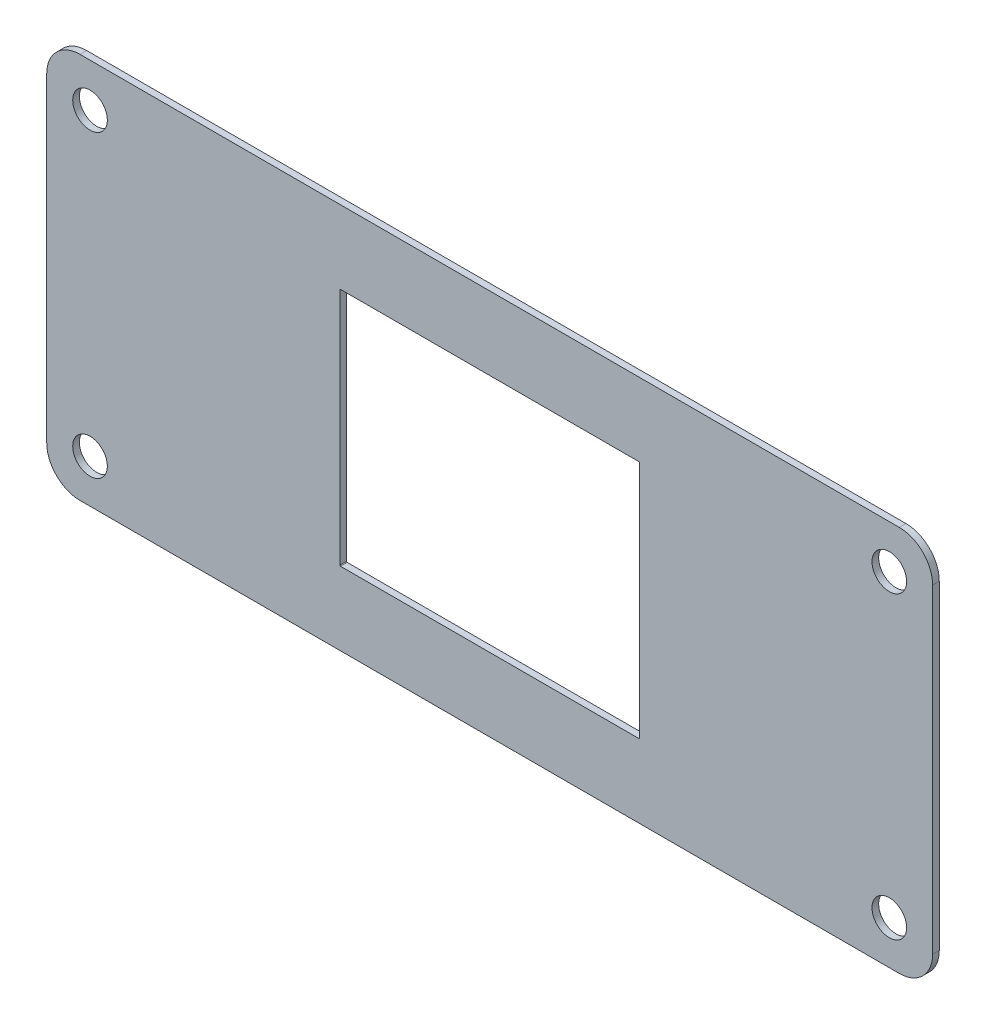
ISO-10303-21;
HEADER;
FILE_DESCRIPTION(('STEP AP214'),'2;1');
FILE_NAME('part.step','',(''),(''),'','','');
FILE_SCHEMA(('AUTOMOTIVE_DESIGN { 1 0 10303 214 1 1 1 1 }'));
ENDSEC;
DATA;
#1=APPLICATION_CONTEXT('core data for automotive mechanical design processes');
#2=APPLICATION_PROTOCOL_DEFINITION('international standard','automotive_design',2000,#1);
#3=PRODUCT_CONTEXT('',#1,'mechanical');
#4=PRODUCT('Part','Part','',(#3));
#5=PRODUCT_RELATED_PRODUCT_CATEGORY('part','',(#4));
#6=PRODUCT_DEFINITION_FORMATION('','',#4);
#7=PRODUCT_DEFINITION_CONTEXT('part definition',#1,'design');
#8=PRODUCT_DEFINITION('design','',#6,#7);
#9=PRODUCT_DEFINITION_SHAPE('','',#8);
#10=(LENGTH_UNIT() NAMED_UNIT(*) SI_UNIT(.MILLI.,.METRE.));
#11=(NAMED_UNIT(*) PLANE_ANGLE_UNIT() SI_UNIT($,.RADIAN.));
#12=(NAMED_UNIT(*) SI_UNIT($,.STERADIAN.) SOLID_ANGLE_UNIT());
#13=UNCERTAINTY_MEASURE_WITH_UNIT(LENGTH_MEASURE(1.E-05),#10,'distance_accuracy_value','');
#14=(GEOMETRIC_REPRESENTATION_CONTEXT(3) GLOBAL_UNCERTAINTY_ASSIGNED_CONTEXT((#13)) GLOBAL_UNIT_ASSIGNED_CONTEXT((#10,
#11,#12)) REPRESENTATION_CONTEXT('',''));
#15=CARTESIAN_POINT('',(0.,0.,0.));
#16=DIRECTION('',(0.,0.,1.));
#17=DIRECTION('',(1.,0.,0.));
#18=AXIS2_PLACEMENT_3D('',#15,#16,#17);
#19=CARTESIAN_POINT('',(0.,0.,1.));
#20=DIRECTION('',(0.,0.,-1.));
#21=DIRECTION('',(-1.,0.,0.));
#22=AXIS2_PLACEMENT_3D('',#19,#20,#21);
#23=PLANE('',#22);
#24=CARTESIAN_POINT('',(-60.,-22.5,1.));
#25=DIRECTION('',(0.,0.,-1.));
#26=DIRECTION('',(-1.,0.,0.));
#27=AXIS2_PLACEMENT_3D('',#24,#25,#26);
#28=CIRCLE('',#27,2.6);
#29=CARTESIAN_POINT('',(-62.6,-22.5,1.));
#30=VERTEX_POINT('',#29);
#31=EDGE_CURVE('E507',#30,#30,#28,.T.);
#32=ORIENTED_EDGE('',*,*,#31,.T.);
#33=EDGE_LOOP('',(#32));
#34=FACE_BOUND('',#33,.T.);
#35=CARTESIAN_POINT('',(60.,-22.5,1.));
#36=DIRECTION('',(0.,0.,-1.));
#37=DIRECTION('',(-1.,0.,0.));
#38=AXIS2_PLACEMENT_3D('',#35,#36,#37);
#39=CIRCLE('',#38,2.59999999999999);
#40=CARTESIAN_POINT('',(57.4,-22.5,1.));
#41=VERTEX_POINT('',#40);
#42=EDGE_CURVE('E499',#41,#41,#39,.T.);
#43=ORIENTED_EDGE('',*,*,#42,.T.);
#44=EDGE_LOOP('',(#43));
#45=FACE_BOUND('',#44,.T.);
#46=CARTESIAN_POINT('',(60.,22.5,1.));
#47=DIRECTION('',(0.,0.,-1.));
#48=DIRECTION('',(-1.,0.,0.));
#49=AXIS2_PLACEMENT_3D('',#46,#47,#48);
#50=CIRCLE('',#49,2.59999999999999);
#51=CARTESIAN_POINT('',(57.4,22.5,1.));
#52=VERTEX_POINT('',#51);
#53=EDGE_CURVE('E486',#52,#52,#50,.T.);
#54=ORIENTED_EDGE('',*,*,#53,.T.);
#55=EDGE_LOOP('',(#54));
#56=FACE_BOUND('',#55,.T.);
#57=CARTESIAN_POINT('',(-60.,22.5,1.));
#58=DIRECTION('',(0.,0.,-1.));
#59=DIRECTION('',(-1.,0.,0.));
#60=AXIS2_PLACEMENT_3D('',#57,#58,#59);
#61=CIRCLE('',#60,2.6);
#62=CARTESIAN_POINT('',(-62.6,22.5,1.));
#63=VERTEX_POINT('',#62);
#64=EDGE_CURVE('E469',#63,#63,#61,.T.);
#65=ORIENTED_EDGE('',*,*,#64,.T.);
#66=EDGE_LOOP('',(#65));
#67=FACE_BOUND('',#66,.T.);
#68=DIRECTION('',(0.,-1.,0.));
#69=VECTOR('',#68,1.);
#70=CARTESIAN_POINT('',(-66.5,-29.,1.));
#71=LINE('',#70,#69);
#72=CARTESIAN_POINT('',(-66.5,24.,1.));
#73=VERTEX_POINT('',#72);
#74=CARTESIAN_POINT('',(-66.5,-24.,1.));
#75=VERTEX_POINT('',#74);
#76=EDGE_CURVE('E224',#73,#75,#71,.T.);
#77=ORIENTED_EDGE('',*,*,#76,.T.);
#78=CARTESIAN_POINT('',(-61.5,-24.,1.));
#79=DIRECTION('',(0.,0.,-1.));
#80=DIRECTION('',(-1.,0.,0.));
#81=AXIS2_PLACEMENT_3D('',#78,#79,#80);
#82=CIRCLE('',#81,5.);
#83=CARTESIAN_POINT('',(-61.5,-29.,1.));
#84=VERTEX_POINT('',#83);
#85=EDGE_CURVE('E259',#75,#84,#82,.F.);
#86=ORIENTED_EDGE('',*,*,#85,.T.);
#87=DIRECTION('',(1.,0.,0.));
#88=VECTOR('',#87,1.);
#89=CARTESIAN_POINT('',(-66.5,-29.,1.));
#90=LINE('',#89,#88);
#91=CARTESIAN_POINT('',(61.5,-29.,1.));
#92=VERTEX_POINT('',#91);
#93=EDGE_CURVE('E218',#84,#92,#90,.T.);
#94=ORIENTED_EDGE('',*,*,#93,.T.);
#95=CARTESIAN_POINT('',(61.5,-24.,1.));
#96=DIRECTION('',(0.,0.,-1.));
#97=DIRECTION('',(-1.,0.,0.));
#98=AXIS2_PLACEMENT_3D('',#95,#96,#97);
#99=CIRCLE('',#98,5.);
#100=CARTESIAN_POINT('',(66.5,-24.,1.));
#101=VERTEX_POINT('',#100);
#102=EDGE_CURVE('E256',#92,#101,#99,.F.);
#103=ORIENTED_EDGE('',*,*,#102,.T.);
#104=DIRECTION('',(0.,1.,0.));
#105=VECTOR('',#104,1.);
#106=CARTESIAN_POINT('',(66.5,-29.,1.));
#107=LINE('',#106,#105);
#108=CARTESIAN_POINT('',(66.5,24.,1.));
#109=VERTEX_POINT('',#108);
#110=EDGE_CURVE('E207',#101,#109,#107,.T.);
#111=ORIENTED_EDGE('',*,*,#110,.T.);
#112=CARTESIAN_POINT('',(61.5,24.,1.));
#113=DIRECTION('',(0.,0.,-1.));
#114=DIRECTION('',(-1.,0.,0.));
#115=AXIS2_PLACEMENT_3D('',#112,#113,#114);
#116=CIRCLE('',#115,5.);
#117=CARTESIAN_POINT('',(61.5,29.,1.));
#118=VERTEX_POINT('',#117);
#119=EDGE_CURVE('E65',#109,#118,#116,.F.);
#120=ORIENTED_EDGE('',*,*,#119,.T.);
#121=DIRECTION('',(-1.,0.,0.));
#122=VECTOR('',#121,1.);
#123=CARTESIAN_POINT('',(-66.5,29.,1.));
#124=LINE('',#123,#122);
#125=CARTESIAN_POINT('',(-61.5,29.,1.));
#126=VERTEX_POINT('',#125);
#127=EDGE_CURVE('E210',#118,#126,#124,.T.);
#128=ORIENTED_EDGE('',*,*,#127,.T.);
#129=CARTESIAN_POINT('',(-61.5,24.,1.));
#130=DIRECTION('',(0.,0.,-1.));
#131=DIRECTION('',(-1.,0.,0.));
#132=AXIS2_PLACEMENT_3D('',#129,#130,#131);
#133=CIRCLE('',#132,5.);
#134=EDGE_CURVE('E252',#126,#73,#133,.F.);
#135=ORIENTED_EDGE('',*,*,#134,.T.);
#136=EDGE_LOOP('',(#77,#86,#94,#103,#111,#120,#128,#135));
#137=FACE_BOUND('',#136,.T.);
#138=CARTESIAN_POINT('',(22.4,-17.9,1.));
#139=DIRECTION('',(0.,0.,-1.));
#140=DIRECTION('',(-1.,0.,0.));
#141=AXIS2_PLACEMENT_3D('',#138,#139,#140);
#142=CIRCLE('',#141,0.0999999999999994);
#143=CARTESIAN_POINT('',(22.5,-17.9,1.));
#144=VERTEX_POINT('',#143);
#145=CARTESIAN_POINT('',(22.4,-18.,1.));
#146=VERTEX_POINT('',#145);
#147=EDGE_CURVE('E175',#144,#146,#142,.T.);
#148=ORIENTED_EDGE('',*,*,#147,.T.);
#149=DIRECTION('',(-1.,0.,0.));
#150=VECTOR('',#149,1.);
#151=CARTESIAN_POINT('',(-22.4,-18.,1.));
#152=LINE('',#151,#150);
#153=CARTESIAN_POINT('',(-22.4,-18.,1.));
#154=VERTEX_POINT('',#153);
#155=EDGE_CURVE('E158',#146,#154,#152,.T.);
#156=ORIENTED_EDGE('',*,*,#155,.T.);
#157=CARTESIAN_POINT('',(-22.4,-17.9,1.));
#158=DIRECTION('',(0.,0.,-1.));
#159=DIRECTION('',(-1.,0.,0.));
#160=AXIS2_PLACEMENT_3D('',#157,#158,#159);
#161=CIRCLE('',#160,0.0999999999999959);
#162=CARTESIAN_POINT('',(-22.5,-17.9,1.));
#163=VERTEX_POINT('',#162);
#164=EDGE_CURVE('E462',#154,#163,#161,.T.);
#165=ORIENTED_EDGE('',*,*,#164,.T.);
#166=DIRECTION('',(0.,1.,0.));
#167=VECTOR('',#166,1.);
#168=CARTESIAN_POINT('',(-22.5,-17.9,1.));
#169=LINE('',#168,#167);
#170=CARTESIAN_POINT('',(-22.5,17.9,1.));
#171=VERTEX_POINT('',#170);
#172=EDGE_CURVE('E461',#163,#171,#169,.T.);
#173=ORIENTED_EDGE('',*,*,#172,.T.);
#174=CARTESIAN_POINT('',(-22.4,17.9,1.));
#175=DIRECTION('',(0.,0.,-1.));
#176=DIRECTION('',(-1.,0.,0.));
#177=AXIS2_PLACEMENT_3D('',#174,#175,#176);
#178=CIRCLE('',#177,0.0999999999999959);
#179=CARTESIAN_POINT('',(-22.4,18.,1.));
#180=VERTEX_POINT('',#179);
#181=EDGE_CURVE('E466',#171,#180,#178,.T.);
#182=ORIENTED_EDGE('',*,*,#181,.T.);
#183=DIRECTION('',(1.,0.,0.));
#184=VECTOR('',#183,1.);
#185=CARTESIAN_POINT('',(-22.4,18.,1.));
#186=LINE('',#185,#184);
#187=CARTESIAN_POINT('',(22.4,18.,1.));
#188=VERTEX_POINT('',#187);
#189=EDGE_CURVE('E454',#180,#188,#186,.T.);
#190=ORIENTED_EDGE('',*,*,#189,.T.);
#191=CARTESIAN_POINT('',(22.4,17.9,1.));
#192=DIRECTION('',(0.,0.,-1.));
#193=DIRECTION('',(-1.,0.,0.));
#194=AXIS2_PLACEMENT_3D('',#191,#192,#193);
#195=CIRCLE('',#194,0.0999999999999994);
#196=CARTESIAN_POINT('',(22.5,17.9,1.));
#197=VERTEX_POINT('',#196);
#198=EDGE_CURVE('E190',#188,#197,#195,.T.);
#199=ORIENTED_EDGE('',*,*,#198,.T.);
#200=DIRECTION('',(0.,-1.,0.));
#201=VECTOR('',#200,1.);
#202=CARTESIAN_POINT('',(22.5,-17.9,1.));
#203=LINE('',#202,#201);
#204=EDGE_CURVE('E183',#197,#144,#203,.T.);
#205=ORIENTED_EDGE('',*,*,#204,.T.);
#206=EDGE_LOOP('',(#148,#156,#165,#173,#182,#190,#199,#205));
#207=FACE_BOUND('',#206,.T.);
#208=ADVANCED_FACE('F44',(#34,#45,#56,#67,#137,#207),#23,.F.);
#209=CARTESIAN_POINT('',(0.,0.,0.));
#210=DIRECTION('',(0.,0.,-1.));
#211=DIRECTION('',(-1.,0.,0.));
#212=AXIS2_PLACEMENT_3D('',#209,#210,#211);
#213=PLANE('',#212);
#214=CARTESIAN_POINT('',(-60.,-22.5,0.));
#215=DIRECTION('',(0.,0.,1.));
#216=DIRECTION('',(-1.,0.,0.));
#217=AXIS2_PLACEMENT_3D('',#214,#215,#216);
#218=CIRCLE('',#217,2.6);
#219=CARTESIAN_POINT('',(-62.6,-22.5,0.));
#220=VERTEX_POINT('',#219);
#221=EDGE_CURVE('E510',#220,#220,#218,.T.);
#222=ORIENTED_EDGE('',*,*,#221,.T.);
#223=EDGE_LOOP('',(#222));
#224=FACE_BOUND('',#223,.T.);
#225=CARTESIAN_POINT('',(60.,-22.5,0.));
#226=DIRECTION('',(0.,0.,1.));
#227=DIRECTION('',(1.,0.,0.));
#228=AXIS2_PLACEMENT_3D('',#225,#226,#227);
#229=CIRCLE('',#228,2.59999999999999);
#230=CARTESIAN_POINT('',(62.6,-22.5,0.));
#231=VERTEX_POINT('',#230);
#232=EDGE_CURVE('E504',#231,#231,#229,.T.);
#233=ORIENTED_EDGE('',*,*,#232,.T.);
#234=EDGE_LOOP('',(#233));
#235=FACE_BOUND('',#234,.T.);
#236=CARTESIAN_POINT('',(60.,22.5,0.));
#237=DIRECTION('',(0.,0.,1.));
#238=DIRECTION('',(-1.,0.,0.));
#239=AXIS2_PLACEMENT_3D('',#236,#237,#238);
#240=CIRCLE('',#239,2.59999999999999);
#241=CARTESIAN_POINT('',(57.4,22.5,0.));
#242=VERTEX_POINT('',#241);
#243=EDGE_CURVE('E497',#242,#242,#240,.T.);
#244=ORIENTED_EDGE('',*,*,#243,.T.);
#245=EDGE_LOOP('',(#244));
#246=FACE_BOUND('',#245,.T.);
#247=CARTESIAN_POINT('',(-60.,22.5,0.));
#248=DIRECTION('',(0.,0.,1.));
#249=DIRECTION('',(1.,0.,0.));
#250=AXIS2_PLACEMENT_3D('',#247,#248,#249);
#251=CIRCLE('',#250,2.6);
#252=CARTESIAN_POINT('',(-57.4,22.5,0.));
#253=VERTEX_POINT('',#252);
#254=EDGE_CURVE('E464',#253,#253,#251,.T.);
#255=ORIENTED_EDGE('',*,*,#254,.T.);
#256=EDGE_LOOP('',(#255));
#257=FACE_BOUND('',#256,.T.);
#258=DIRECTION('',(1.,0.,0.));
#259=VECTOR('',#258,1.);
#260=CARTESIAN_POINT('',(-66.5,-29.,0.));
#261=LINE('',#260,#259);
#262=CARTESIAN_POINT('',(-61.5,-29.,0.));
#263=VERTEX_POINT('',#262);
#264=CARTESIAN_POINT('',(61.5,-29.,0.));
#265=VERTEX_POINT('',#264);
#266=EDGE_CURVE('E211',#263,#265,#261,.T.);
#267=ORIENTED_EDGE('',*,*,#266,.F.);
#268=CARTESIAN_POINT('',(-61.5,-24.,0.));
#269=DIRECTION('',(0.,0.,-1.));
#270=DIRECTION('',(-1.,0.,0.));
#271=AXIS2_PLACEMENT_3D('',#268,#269,#270);
#272=CIRCLE('',#271,5.);
#273=CARTESIAN_POINT('',(-66.5,-24.,0.));
#274=VERTEX_POINT('',#273);
#275=EDGE_CURVE('E245',#263,#274,#272,.T.);
#276=ORIENTED_EDGE('',*,*,#275,.T.);
#277=DIRECTION('',(0.,-1.,0.));
#278=VECTOR('',#277,1.);
#279=CARTESIAN_POINT('',(-66.5,-29.,0.));
#280=LINE('',#279,#278);
#281=CARTESIAN_POINT('',(-66.5,24.,0.));
#282=VERTEX_POINT('',#281);
#283=EDGE_CURVE('E230',#282,#274,#280,.T.);
#284=ORIENTED_EDGE('',*,*,#283,.F.);
#285=CARTESIAN_POINT('',(-61.5,24.,0.));
#286=DIRECTION('',(0.,0.,-1.));
#287=DIRECTION('',(-1.,0.,0.));
#288=AXIS2_PLACEMENT_3D('',#285,#286,#287);
#289=CIRCLE('',#288,5.);
#290=CARTESIAN_POINT('',(-61.5,29.,0.));
#291=VERTEX_POINT('',#290);
#292=EDGE_CURVE('E239',#282,#291,#289,.T.);
#293=ORIENTED_EDGE('',*,*,#292,.T.);
#294=DIRECTION('',(-1.,0.,0.));
#295=VECTOR('',#294,1.);
#296=CARTESIAN_POINT('',(-66.5,29.,0.));
#297=LINE('',#296,#295);
#298=CARTESIAN_POINT('',(61.5,29.,0.));
#299=VERTEX_POINT('',#298);
#300=EDGE_CURVE('E228',#299,#291,#297,.T.);
#301=ORIENTED_EDGE('',*,*,#300,.F.);
#302=CARTESIAN_POINT('',(61.5,24.,0.));
#303=DIRECTION('',(0.,0.,-1.));
#304=DIRECTION('',(-1.,0.,0.));
#305=AXIS2_PLACEMENT_3D('',#302,#303,#304);
#306=CIRCLE('',#305,5.);
#307=CARTESIAN_POINT('',(66.5,24.,0.));
#308=VERTEX_POINT('',#307);
#309=EDGE_CURVE('E241',#299,#308,#306,.T.);
#310=ORIENTED_EDGE('',*,*,#309,.T.);
#311=DIRECTION('',(0.,1.,0.));
#312=VECTOR('',#311,1.);
#313=CARTESIAN_POINT('',(66.5,-29.,0.));
#314=LINE('',#313,#312);
#315=CARTESIAN_POINT('',(66.5,-24.,0.));
#316=VERTEX_POINT('',#315);
#317=EDGE_CURVE('E170',#316,#308,#314,.T.);
#318=ORIENTED_EDGE('',*,*,#317,.F.);
#319=CARTESIAN_POINT('',(61.5,-24.,0.));
#320=DIRECTION('',(0.,0.,-1.));
#321=DIRECTION('',(-1.,0.,0.));
#322=AXIS2_PLACEMENT_3D('',#319,#320,#321);
#323=CIRCLE('',#322,5.);
#324=EDGE_CURVE('E243',#316,#265,#323,.T.);
#325=ORIENTED_EDGE('',*,*,#324,.T.);
#326=EDGE_LOOP('',(#267,#276,#284,#293,#301,#310,#318,#325));
#327=FACE_BOUND('',#326,.T.);
#328=DIRECTION('',(1.,0.,0.));
#329=VECTOR('',#328,1.);
#330=CARTESIAN_POINT('',(-22.4,-18.,0.));
#331=LINE('',#330,#329);
#332=CARTESIAN_POINT('',(-22.4,-18.,0.));
#333=VERTEX_POINT('',#332);
#334=CARTESIAN_POINT('',(22.4,-18.,0.));
#335=VERTEX_POINT('',#334);
#336=EDGE_CURVE('E179',#333,#335,#331,.T.);
#337=ORIENTED_EDGE('',*,*,#336,.T.);
#338=CARTESIAN_POINT('',(22.4,-17.9,0.));
#339=DIRECTION('',(0.,0.,1.));
#340=DIRECTION('',(-1.,0.,0.));
#341=AXIS2_PLACEMENT_3D('',#338,#339,#340);
#342=CIRCLE('',#341,0.0999999999999994);
#343=CARTESIAN_POINT('',(22.5,-17.9,0.));
#344=VERTEX_POINT('',#343);
#345=EDGE_CURVE('E178',#335,#344,#342,.T.);
#346=ORIENTED_EDGE('',*,*,#345,.T.);
#347=DIRECTION('',(0.,1.,0.));
#348=VECTOR('',#347,1.);
#349=CARTESIAN_POINT('',(22.5,-17.9,0.));
#350=LINE('',#349,#348);
#351=CARTESIAN_POINT('',(22.5,17.9,0.));
#352=VERTEX_POINT('',#351);
#353=EDGE_CURVE('E187',#344,#352,#350,.T.);
#354=ORIENTED_EDGE('',*,*,#353,.T.);
#355=CARTESIAN_POINT('',(22.4,17.9,0.));
#356=DIRECTION('',(0.,0.,1.));
#357=DIRECTION('',(1.,0.,0.));
#358=AXIS2_PLACEMENT_3D('',#355,#356,#357);
#359=CIRCLE('',#358,0.0999999999999994);
#360=CARTESIAN_POINT('',(22.4,18.,0.));
#361=VERTEX_POINT('',#360);
#362=EDGE_CURVE('E426',#352,#361,#359,.T.);
#363=ORIENTED_EDGE('',*,*,#362,.T.);
#364=DIRECTION('',(-1.,0.,0.));
#365=VECTOR('',#364,1.);
#366=CARTESIAN_POINT('',(-22.4,18.,0.));
#367=LINE('',#366,#365);
#368=CARTESIAN_POINT('',(-22.4,18.,0.));
#369=VERTEX_POINT('',#368);
#370=EDGE_CURVE('E430',#361,#369,#367,.T.);
#371=ORIENTED_EDGE('',*,*,#370,.T.);
#372=CARTESIAN_POINT('',(-22.4,17.9,0.));
#373=DIRECTION('',(0.,0.,1.));
#374=DIRECTION('',(1.,0.,0.));
#375=AXIS2_PLACEMENT_3D('',#372,#373,#374);
#376=CIRCLE('',#375,0.0999999999999959);
#377=CARTESIAN_POINT('',(-22.5,17.9,0.));
#378=VERTEX_POINT('',#377);
#379=EDGE_CURVE('E434',#369,#378,#376,.T.);
#380=ORIENTED_EDGE('',*,*,#379,.T.);
#381=DIRECTION('',(0.,-1.,0.));
#382=VECTOR('',#381,1.);
#383=CARTESIAN_POINT('',(-22.5,-17.9,0.));
#384=LINE('',#383,#382);
#385=CARTESIAN_POINT('',(-22.5,-17.9,0.));
#386=VERTEX_POINT('',#385);
#387=EDGE_CURVE('E437',#378,#386,#384,.T.);
#388=ORIENTED_EDGE('',*,*,#387,.T.);
#389=CARTESIAN_POINT('',(-22.4,-17.9,0.));
#390=DIRECTION('',(0.,0.,1.));
#391=DIRECTION('',(-1.,0.,0.));
#392=AXIS2_PLACEMENT_3D('',#389,#390,#391);
#393=CIRCLE('',#392,0.0999999999999959);
#394=EDGE_CURVE('E440',#386,#333,#393,.T.);
#395=ORIENTED_EDGE('',*,*,#394,.T.);
#396=EDGE_LOOP('',(#337,#346,#354,#363,#371,#380,#388,#395));
#397=FACE_BOUND('',#396,.T.);
#398=ADVANCED_FACE('F276',(#224,#235,#246,#257,#327,#397),#213,.T.);
#399=CARTESIAN_POINT('',(66.5,-29.,1.));
#400=DIRECTION('',(-1.,0.,0.));
#401=DIRECTION('',(0.,0.,1.));
#402=AXIS2_PLACEMENT_3D('',#399,#400,#401);
#403=PLANE('',#402);
#404=ORIENTED_EDGE('',*,*,#110,.F.);
#405=DIRECTION('',(0.,0.,-1.));
#406=VECTOR('',#405,1.);
#407=CARTESIAN_POINT('',(66.5,-24.,1.));
#408=LINE('',#407,#406);
#409=EDGE_CURVE('E264',#101,#316,#408,.T.);
#410=ORIENTED_EDGE('',*,*,#409,.T.);
#411=ORIENTED_EDGE('',*,*,#317,.T.);
#412=DIRECTION('',(0.,0.,-1.));
#413=VECTOR('',#412,1.);
#414=CARTESIAN_POINT('',(66.5,24.,1.));
#415=LINE('',#414,#413);
#416=EDGE_CURVE('E262',#308,#109,#415,.F.);
#417=ORIENTED_EDGE('',*,*,#416,.T.);
#418=EDGE_LOOP('',(#404,#410,#411,#417));
#419=FACE_BOUND('',#418,.T.);
#420=ADVANCED_FACE('F270',(#419),#403,.F.);
#421=CARTESIAN_POINT('',(-66.5,29.,1.));
#422=DIRECTION('',(0.,-1.,0.));
#423=DIRECTION('',(0.,0.,-1.));
#424=AXIS2_PLACEMENT_3D('',#421,#422,#423);
#425=PLANE('',#424);
#426=ORIENTED_EDGE('',*,*,#127,.F.);
#427=DIRECTION('',(0.,0.,-1.));
#428=VECTOR('',#427,1.);
#429=CARTESIAN_POINT('',(61.5,29.,1.));
#430=LINE('',#429,#428);
#431=EDGE_CURVE('E12',#118,#299,#430,.T.);
#432=ORIENTED_EDGE('',*,*,#431,.T.);
#433=ORIENTED_EDGE('',*,*,#300,.T.);
#434=DIRECTION('',(0.,0.,-1.));
#435=VECTOR('',#434,1.);
#436=CARTESIAN_POINT('',(-61.5,29.,1.));
#437=LINE('',#436,#435);
#438=EDGE_CURVE('E52',#291,#126,#437,.F.);
#439=ORIENTED_EDGE('',*,*,#438,.T.);
#440=EDGE_LOOP('',(#426,#432,#433,#439));
#441=FACE_BOUND('',#440,.T.);
#442=ADVANCED_FACE('F282',(#441),#425,.F.);
#443=CARTESIAN_POINT('',(-66.5,-29.,1.));
#444=DIRECTION('',(1.,0.,0.));
#445=DIRECTION('',(0.,0.,-1.));
#446=AXIS2_PLACEMENT_3D('',#443,#444,#445);
#447=PLANE('',#446);
#448=ORIENTED_EDGE('',*,*,#283,.T.);
#449=DIRECTION('',(0.,0.,-1.));
#450=VECTOR('',#449,1.);
#451=CARTESIAN_POINT('',(-66.5,-24.,1.));
#452=LINE('',#451,#450);
#453=EDGE_CURVE('E250',#274,#75,#452,.F.);
#454=ORIENTED_EDGE('',*,*,#453,.T.);
#455=ORIENTED_EDGE('',*,*,#76,.F.);
#456=DIRECTION('',(0.,0.,-1.));
#457=VECTOR('',#456,1.);
#458=CARTESIAN_POINT('',(-66.5,24.,1.));
#459=LINE('',#458,#457);
#460=EDGE_CURVE('E247',#73,#282,#459,.T.);
#461=ORIENTED_EDGE('',*,*,#460,.T.);
#462=EDGE_LOOP('',(#448,#454,#455,#461));
#463=FACE_BOUND('',#462,.T.);
#464=ADVANCED_FACE('F301',(#463),#447,.F.);
#465=CARTESIAN_POINT('',(-66.5,-29.,1.));
#466=DIRECTION('',(0.,1.,0.));
#467=DIRECTION('',(0.,0.,1.));
#468=AXIS2_PLACEMENT_3D('',#465,#466,#467);
#469=PLANE('',#468);
#470=ORIENTED_EDGE('',*,*,#93,.F.);
#471=DIRECTION('',(0.,0.,-1.));
#472=VECTOR('',#471,1.);
#473=CARTESIAN_POINT('',(-61.5,-29.,1.));
#474=LINE('',#473,#472);
#475=EDGE_CURVE('E236',#84,#263,#474,.T.);
#476=ORIENTED_EDGE('',*,*,#475,.T.);
#477=ORIENTED_EDGE('',*,*,#266,.T.);
#478=DIRECTION('',(0.,0.,-1.));
#479=VECTOR('',#478,1.);
#480=CARTESIAN_POINT('',(61.5,-29.,1.));
#481=LINE('',#480,#479);
#482=EDGE_CURVE('E223',#265,#92,#481,.F.);
#483=ORIENTED_EDGE('',*,*,#482,.T.);
#484=EDGE_LOOP('',(#470,#476,#477,#483));
#485=FACE_BOUND('',#484,.T.);
#486=ADVANCED_FACE('F298',(#485),#469,.F.);
#487=CARTESIAN_POINT('',(22.4,-17.9,1.001));
#488=DIRECTION('',(0.,0.,-1.));
#489=DIRECTION('',(-1.,0.,0.));
#490=AXIS2_PLACEMENT_3D('',#487,#488,#489);
#491=CYLINDRICAL_SURFACE('',#490,0.0999999999999994);
#492=DIRECTION('',(0.,0.,-1.));
#493=VECTOR('',#492,1.);
#494=CARTESIAN_POINT('',(22.5,-17.9,1.001));
#495=LINE('',#494,#493);
#496=EDGE_CURVE('E171',#144,#344,#495,.T.);
#497=ORIENTED_EDGE('',*,*,#496,.T.);
#498=ORIENTED_EDGE('',*,*,#345,.F.);
#499=DIRECTION('',(0.,0.,-1.));
#500=VECTOR('',#499,1.);
#501=CARTESIAN_POINT('',(22.4,-18.,1.001));
#502=LINE('',#501,#500);
#503=EDGE_CURVE('E162',#146,#335,#502,.T.);
#504=ORIENTED_EDGE('',*,*,#503,.F.);
#505=ORIENTED_EDGE('',*,*,#147,.F.);
#506=EDGE_LOOP('',(#497,#498,#504,#505));
#507=FACE_BOUND('',#506,.T.);
#508=ADVANCED_FACE('F174',(#507),#491,.F.);
#509=CARTESIAN_POINT('',(22.5,-17.9,1.001));
#510=DIRECTION('',(-1.,0.,0.));
#511=DIRECTION('',(0.,0.,1.));
#512=AXIS2_PLACEMENT_3D('',#509,#510,#511);
#513=PLANE('',#512);
#514=DIRECTION('',(0.,0.,-1.));
#515=VECTOR('',#514,1.);
#516=CARTESIAN_POINT('',(22.5,17.9,1.001));
#517=LINE('',#516,#515);
#518=EDGE_CURVE('E421',#197,#352,#517,.T.);
#519=ORIENTED_EDGE('',*,*,#518,.T.);
#520=ORIENTED_EDGE('',*,*,#353,.F.);
#521=ORIENTED_EDGE('',*,*,#496,.F.);
#522=ORIENTED_EDGE('',*,*,#204,.F.);
#523=EDGE_LOOP('',(#519,#520,#521,#522));
#524=FACE_BOUND('',#523,.T.);
#525=ADVANCED_FACE('F412',(#524),#513,.T.);
#526=CARTESIAN_POINT('',(22.4,17.9,1.001));
#527=DIRECTION('',(0.,0.,-1.));
#528=DIRECTION('',(-1.,0.,0.));
#529=AXIS2_PLACEMENT_3D('',#526,#527,#528);
#530=CYLINDRICAL_SURFACE('',#529,0.0999999999999994);
#531=DIRECTION('',(0.,0.,-1.));
#532=VECTOR('',#531,1.);
#533=CARTESIAN_POINT('',(22.4,18.,1.001));
#534=LINE('',#533,#532);
#535=EDGE_CURVE('E424',#188,#361,#534,.T.);
#536=ORIENTED_EDGE('',*,*,#535,.T.);
#537=ORIENTED_EDGE('',*,*,#362,.F.);
#538=ORIENTED_EDGE('',*,*,#518,.F.);
#539=ORIENTED_EDGE('',*,*,#198,.F.);
#540=EDGE_LOOP('',(#536,#537,#538,#539));
#541=FACE_BOUND('',#540,.T.);
#542=ADVANCED_FACE('F409',(#541),#530,.F.);
#543=CARTESIAN_POINT('',(-22.4,18.,1.001));
#544=DIRECTION('',(0.,-1.,0.));
#545=DIRECTION('',(0.,0.,-1.));
#546=AXIS2_PLACEMENT_3D('',#543,#544,#545);
#547=PLANE('',#546);
#548=DIRECTION('',(0.,0.,-1.));
#549=VECTOR('',#548,1.);
#550=CARTESIAN_POINT('',(-22.4,18.,1.001));
#551=LINE('',#550,#549);
#552=EDGE_CURVE('E449',#180,#369,#551,.T.);
#553=ORIENTED_EDGE('',*,*,#552,.T.);
#554=ORIENTED_EDGE('',*,*,#370,.F.);
#555=ORIENTED_EDGE('',*,*,#535,.F.);
#556=ORIENTED_EDGE('',*,*,#189,.F.);
#557=EDGE_LOOP('',(#553,#554,#555,#556));
#558=FACE_BOUND('',#557,.T.);
#559=ADVANCED_FACE('F405',(#558),#547,.T.);
#560=CARTESIAN_POINT('',(-22.4,17.9,1.001));
#561=DIRECTION('',(0.,0.,-1.));
#562=DIRECTION('',(-1.,0.,0.));
#563=AXIS2_PLACEMENT_3D('',#560,#561,#562);
#564=CYLINDRICAL_SURFACE('',#563,0.0999999999999959);
#565=DIRECTION('',(0.,0.,-1.));
#566=VECTOR('',#565,1.);
#567=CARTESIAN_POINT('',(-22.5,17.9,1.001));
#568=LINE('',#567,#566);
#569=EDGE_CURVE('E447',#171,#378,#568,.T.);
#570=ORIENTED_EDGE('',*,*,#569,.T.);
#571=ORIENTED_EDGE('',*,*,#379,.F.);
#572=ORIENTED_EDGE('',*,*,#552,.F.);
#573=ORIENTED_EDGE('',*,*,#181,.F.);
#574=EDGE_LOOP('',(#570,#571,#572,#573));
#575=FACE_BOUND('',#574,.T.);
#576=ADVANCED_FACE('F401',(#575),#564,.F.);
#577=CARTESIAN_POINT('',(-22.5,-17.9,1.001));
#578=DIRECTION('',(1.,0.,0.));
#579=DIRECTION('',(0.,0.,-1.));
#580=AXIS2_PLACEMENT_3D('',#577,#578,#579);
#581=PLANE('',#580);
#582=DIRECTION('',(0.,0.,-1.));
#583=VECTOR('',#582,1.);
#584=CARTESIAN_POINT('',(-22.5,-17.9,1.001));
#585=LINE('',#584,#583);
#586=EDGE_CURVE('E445',#163,#386,#585,.T.);
#587=ORIENTED_EDGE('',*,*,#586,.T.);
#588=ORIENTED_EDGE('',*,*,#387,.F.);
#589=ORIENTED_EDGE('',*,*,#569,.F.);
#590=ORIENTED_EDGE('',*,*,#172,.F.);
#591=EDGE_LOOP('',(#587,#588,#589,#590));
#592=FACE_BOUND('',#591,.T.);
#593=ADVANCED_FACE('F397',(#592),#581,.T.);
#594=CARTESIAN_POINT('',(-22.4,-17.9,1.001));
#595=DIRECTION('',(0.,0.,-1.));
#596=DIRECTION('',(-1.,0.,0.));
#597=AXIS2_PLACEMENT_3D('',#594,#595,#596);
#598=CYLINDRICAL_SURFACE('',#597,0.0999999999999959);
#599=DIRECTION('',(0.,0.,-1.));
#600=VECTOR('',#599,1.);
#601=CARTESIAN_POINT('',(-22.4,-18.,1.001));
#602=LINE('',#601,#600);
#603=EDGE_CURVE('E164',#154,#333,#602,.T.);
#604=ORIENTED_EDGE('',*,*,#603,.T.);
#605=ORIENTED_EDGE('',*,*,#394,.F.);
#606=ORIENTED_EDGE('',*,*,#586,.F.);
#607=ORIENTED_EDGE('',*,*,#164,.F.);
#608=EDGE_LOOP('',(#604,#605,#606,#607));
#609=FACE_BOUND('',#608,.T.);
#610=ADVANCED_FACE('F394',(#609),#598,.F.);
#611=CARTESIAN_POINT('',(-22.4,-18.,1.001));
#612=DIRECTION('',(0.,1.,0.));
#613=DIRECTION('',(0.,0.,1.));
#614=AXIS2_PLACEMENT_3D('',#611,#612,#613);
#615=PLANE('',#614);
#616=ORIENTED_EDGE('',*,*,#503,.T.);
#617=ORIENTED_EDGE('',*,*,#336,.F.);
#618=ORIENTED_EDGE('',*,*,#603,.F.);
#619=ORIENTED_EDGE('',*,*,#155,.F.);
#620=EDGE_LOOP('',(#616,#617,#618,#619));
#621=FACE_BOUND('',#620,.T.);
#622=ADVANCED_FACE('F160',(#621),#615,.T.);
#623=CARTESIAN_POINT('',(-61.5,-24.,1.));
#624=DIRECTION('',(0.,0.,-1.));
#625=DIRECTION('',(-1.,0.,0.));
#626=AXIS2_PLACEMENT_3D('',#623,#624,#625);
#627=CYLINDRICAL_SURFACE('',#626,5.);
#628=ORIENTED_EDGE('',*,*,#85,.F.);
#629=ORIENTED_EDGE('',*,*,#453,.F.);
#630=ORIENTED_EDGE('',*,*,#275,.F.);
#631=ORIENTED_EDGE('',*,*,#475,.F.);
#632=EDGE_LOOP('',(#628,#629,#630,#631));
#633=FACE_BOUND('',#632,.T.);
#634=ADVANCED_FACE('F296',(#633),#627,.T.);
#635=CARTESIAN_POINT('',(61.5,-24.,1.));
#636=DIRECTION('',(0.,0.,-1.));
#637=DIRECTION('',(-1.,0.,0.));
#638=AXIS2_PLACEMENT_3D('',#635,#636,#637);
#639=CYLINDRICAL_SURFACE('',#638,5.);
#640=ORIENTED_EDGE('',*,*,#102,.F.);
#641=ORIENTED_EDGE('',*,*,#482,.F.);
#642=ORIENTED_EDGE('',*,*,#324,.F.);
#643=ORIENTED_EDGE('',*,*,#409,.F.);
#644=EDGE_LOOP('',(#640,#641,#642,#643));
#645=FACE_BOUND('',#644,.T.);
#646=ADVANCED_FACE('F313',(#645),#639,.T.);
#647=CARTESIAN_POINT('',(61.5,24.,1.));
#648=DIRECTION('',(0.,0.,-1.));
#649=DIRECTION('',(-1.,0.,0.));
#650=AXIS2_PLACEMENT_3D('',#647,#648,#649);
#651=CYLINDRICAL_SURFACE('',#650,5.);
#652=ORIENTED_EDGE('',*,*,#119,.F.);
#653=ORIENTED_EDGE('',*,*,#416,.F.);
#654=ORIENTED_EDGE('',*,*,#309,.F.);
#655=ORIENTED_EDGE('',*,*,#431,.F.);
#656=EDGE_LOOP('',(#652,#653,#654,#655));
#657=FACE_BOUND('',#656,.T.);
#658=ADVANCED_FACE('F281',(#657),#651,.T.);
#659=CARTESIAN_POINT('',(-61.5,24.,1.));
#660=DIRECTION('',(0.,0.,-1.));
#661=DIRECTION('',(-1.,0.,0.));
#662=AXIS2_PLACEMENT_3D('',#659,#660,#661);
#663=CYLINDRICAL_SURFACE('',#662,5.);
#664=ORIENTED_EDGE('',*,*,#134,.F.);
#665=ORIENTED_EDGE('',*,*,#438,.F.);
#666=ORIENTED_EDGE('',*,*,#292,.F.);
#667=ORIENTED_EDGE('',*,*,#460,.F.);
#668=EDGE_LOOP('',(#664,#665,#666,#667));
#669=FACE_BOUND('',#668,.T.);
#670=ADVANCED_FACE('F46',(#669),#663,.T.);
#671=CARTESIAN_POINT('',(-60.,22.5,1.001));
#672=DIRECTION('',(0.,0.,-1.));
#673=DIRECTION('',(-1.,0.,0.));
#674=AXIS2_PLACEMENT_3D('',#671,#672,#673);
#675=CYLINDRICAL_SURFACE('',#674,2.6);
#676=ORIENTED_EDGE('',*,*,#254,.F.);
#677=EDGE_LOOP('',(#676));
#678=FACE_BOUND('',#677,.T.);
#679=ORIENTED_EDGE('',*,*,#64,.F.);
#680=EDGE_LOOP('',(#679));
#681=FACE_BOUND('',#680,.T.);
#682=ADVANCED_FACE('F304',(#678,#681),#675,.F.);
#683=CARTESIAN_POINT('',(60.,22.5,1.001));
#684=DIRECTION('',(0.,0.,-1.));
#685=DIRECTION('',(-1.,0.,0.));
#686=AXIS2_PLACEMENT_3D('',#683,#684,#685);
#687=CYLINDRICAL_SURFACE('',#686,2.59999999999999);
#688=ORIENTED_EDGE('',*,*,#243,.F.);
#689=EDGE_LOOP('',(#688));
#690=FACE_BOUND('',#689,.T.);
#691=ORIENTED_EDGE('',*,*,#53,.F.);
#692=EDGE_LOOP('',(#691));
#693=FACE_BOUND('',#692,.T.);
#694=ADVANCED_FACE('F310',(#690,#693),#687,.F.);
#695=CARTESIAN_POINT('',(60.,-22.5,1.001));
#696=DIRECTION('',(0.,0.,-1.));
#697=DIRECTION('',(-1.,0.,0.));
#698=AXIS2_PLACEMENT_3D('',#695,#696,#697);
#699=CYLINDRICAL_SURFACE('',#698,2.59999999999999);
#700=ORIENTED_EDGE('',*,*,#232,.F.);
#701=EDGE_LOOP('',(#700));
#702=FACE_BOUND('',#701,.T.);
#703=ORIENTED_EDGE('',*,*,#42,.F.);
#704=EDGE_LOOP('',(#703));
#705=FACE_BOUND('',#704,.T.);
#706=ADVANCED_FACE('F366',(#702,#705),#699,.F.);
#707=CARTESIAN_POINT('',(-60.,-22.5,1.001));
#708=DIRECTION('',(0.,0.,-1.));
#709=DIRECTION('',(-1.,0.,0.));
#710=AXIS2_PLACEMENT_3D('',#707,#708,#709);
#711=CYLINDRICAL_SURFACE('',#710,2.6);
#712=ORIENTED_EDGE('',*,*,#221,.F.);
#713=EDGE_LOOP('',(#712));
#714=FACE_BOUND('',#713,.T.);
#715=ORIENTED_EDGE('',*,*,#31,.F.);
#716=EDGE_LOOP('',(#715));
#717=FACE_BOUND('',#716,.T.);
#718=ADVANCED_FACE('F376',(#714,#717),#711,.F.);
#719=CLOSED_SHELL('',(#208,#398,#420,#442,#464,#486,#508,#525,#542,#559,#576,#593,#610,#622,
#634,#646,#658,#670,#682,#694,#706,#718));
#720=MANIFOLD_SOLID_BREP('B2',#719);
#721=ADVANCED_BREP_SHAPE_REPRESENTATION('',(#18,#720),#14);
#722=SHAPE_DEFINITION_REPRESENTATION(#9,#721);
ENDSEC;
END-ISO-10303-21;
